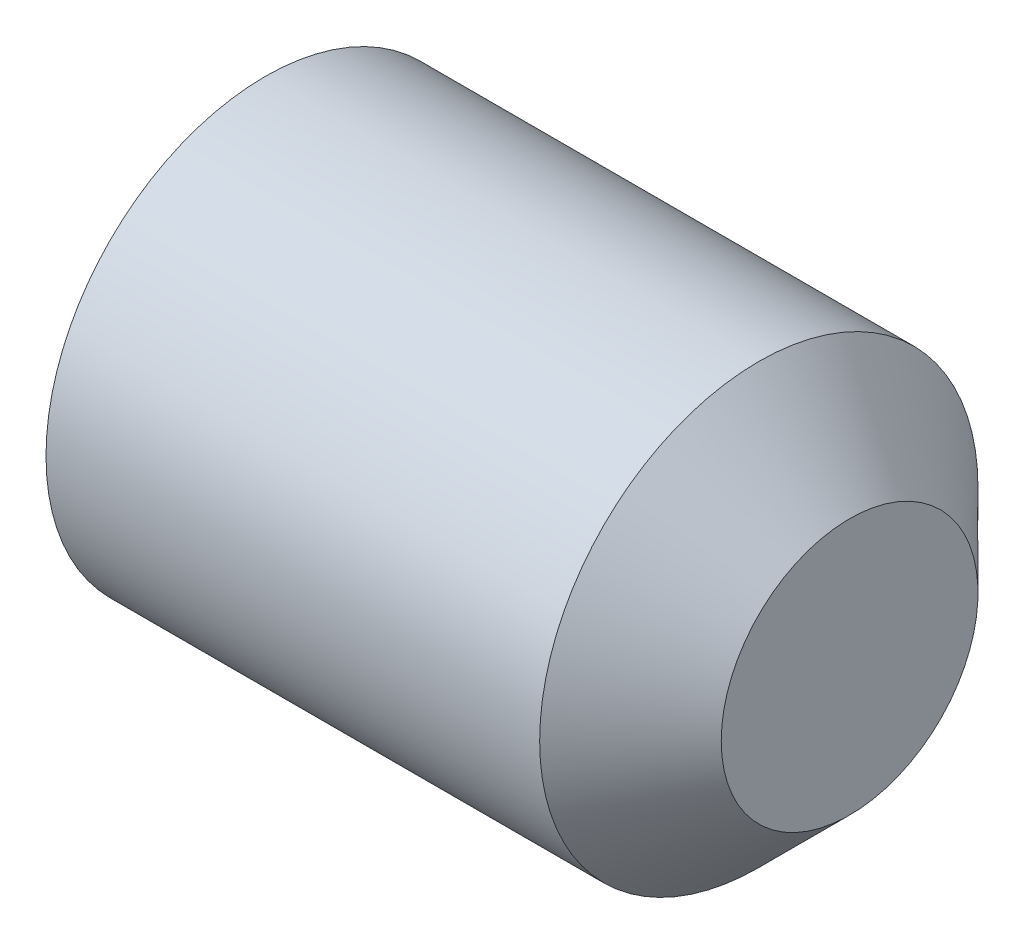
ISO-10303-21;
HEADER;
FILE_DESCRIPTION(('STEP AP214'),'2;1');
FILE_NAME('part.step','',(''),(''),'','','');
FILE_SCHEMA(('AUTOMOTIVE_DESIGN { 1 0 10303 214 1 1 1 1 }'));
ENDSEC;
DATA;
#1=APPLICATION_CONTEXT('core data for automotive mechanical design processes');
#2=APPLICATION_PROTOCOL_DEFINITION('international standard','automotive_design',2000,#1);
#3=PRODUCT_CONTEXT('',#1,'mechanical');
#4=PRODUCT('Part','Part','',(#3));
#5=PRODUCT_RELATED_PRODUCT_CATEGORY('part','',(#4));
#6=PRODUCT_DEFINITION_FORMATION('','',#4);
#7=PRODUCT_DEFINITION_CONTEXT('part definition',#1,'design');
#8=PRODUCT_DEFINITION('design','',#6,#7);
#9=PRODUCT_DEFINITION_SHAPE('','',#8);
#10=(LENGTH_UNIT() NAMED_UNIT(*) SI_UNIT(.MILLI.,.METRE.));
#11=(NAMED_UNIT(*) PLANE_ANGLE_UNIT() SI_UNIT($,.RADIAN.));
#12=(NAMED_UNIT(*) SI_UNIT($,.STERADIAN.) SOLID_ANGLE_UNIT());
#13=UNCERTAINTY_MEASURE_WITH_UNIT(LENGTH_MEASURE(1.E-05),#10,'distance_accuracy_value','');
#14=(GEOMETRIC_REPRESENTATION_CONTEXT(3) GLOBAL_UNCERTAINTY_ASSIGNED_CONTEXT((#13)) GLOBAL_UNIT_ASSIGNED_CONTEXT((#10,
#11,#12)) REPRESENTATION_CONTEXT('',''));
#15=CARTESIAN_POINT('',(0.,0.,0.));
#16=DIRECTION('',(0.,0.,1.));
#17=DIRECTION('',(1.,0.,0.));
#18=AXIS2_PLACEMENT_3D('',#15,#16,#17);
#19=CARTESIAN_POINT('',(0.,1.5,0.));
#20=DIRECTION('',(1.,0.,0.));
#21=DIRECTION('',(0.,0.,-1.));
#22=AXIS2_PLACEMENT_3D('',#19,#20,#21);
#23=PLANE('',#22);
#24=DIRECTION('',(0.,-0.866025403784439,-0.5));
#25=VECTOR('',#24,1.);
#26=CARTESIAN_POINT('',(0.,0.75,-0.433012701892219));
#27=LINE('',#26,#25);
#28=CARTESIAN_POINT('',(0.,0.75,-0.433012701892219));
#29=VERTEX_POINT('',#28);
#30=CARTESIAN_POINT('',(0.,0.,-0.866025403784438));
#31=VERTEX_POINT('',#30);
#32=EDGE_CURVE('E121',#29,#31,#27,.T.);
#33=ORIENTED_EDGE('',*,*,#32,.F.);
#34=DIRECTION('',(0.,0.,-1.));
#35=VECTOR('',#34,1.);
#36=CARTESIAN_POINT('',(0.,0.75,0.43301270189222));
#37=LINE('',#36,#35);
#38=CARTESIAN_POINT('',(0.,0.75,0.43301270189222));
#39=VERTEX_POINT('',#38);
#40=EDGE_CURVE('E47',#39,#29,#37,.T.);
#41=ORIENTED_EDGE('',*,*,#40,.F.);
#42=DIRECTION('',(0.,0.866025403784439,-0.5));
#43=VECTOR('',#42,1.);
#44=CARTESIAN_POINT('',(0.,0.,0.866025403784439));
#45=LINE('',#44,#43);
#46=CARTESIAN_POINT('',(0.,0.,0.866025403784439));
#47=VERTEX_POINT('',#46);
#48=EDGE_CURVE('E130',#47,#39,#45,.T.);
#49=ORIENTED_EDGE('',*,*,#48,.F.);
#50=DIRECTION('',(0.,0.866025403784439,0.5));
#51=VECTOR('',#50,1.);
#52=CARTESIAN_POINT('',(0.,-0.75,0.433012701892219));
#53=LINE('',#52,#51);
#54=CARTESIAN_POINT('',(0.,-0.75,0.433012701892219));
#55=VERTEX_POINT('',#54);
#56=EDGE_CURVE('E128',#55,#47,#53,.T.);
#57=ORIENTED_EDGE('',*,*,#56,.F.);
#58=DIRECTION('',(0.,0.,1.));
#59=VECTOR('',#58,1.);
#60=CARTESIAN_POINT('',(0.,-0.75,-0.43301270189222));
#61=LINE('',#60,#59);
#62=CARTESIAN_POINT('',(0.,-0.75,-0.43301270189222));
#63=VERTEX_POINT('',#62);
#64=EDGE_CURVE('E95',#63,#55,#61,.T.);
#65=ORIENTED_EDGE('',*,*,#64,.F.);
#66=DIRECTION('',(0.,-0.866025403784439,0.5));
#67=VECTOR('',#66,1.);
#68=CARTESIAN_POINT('',(0.,0.,-0.866025403784438));
#69=LINE('',#68,#67);
#70=EDGE_CURVE('E124',#31,#63,#69,.T.);
#71=ORIENTED_EDGE('',*,*,#70,.F.);
#72=EDGE_LOOP('',(#33,#41,#49,#57,#65,#71));
#73=FACE_BOUND('',#72,.T.);
#74=CARTESIAN_POINT('',(0.,0.,0.));
#75=DIRECTION('',(-1.,0.,0.));
#76=DIRECTION('',(0.,0.,1.));
#77=AXIS2_PLACEMENT_3D('',#74,#75,#76);
#78=CIRCLE('',#77,1.5);
#79=CARTESIAN_POINT('',(0.,0.,1.5));
#80=VERTEX_POINT('',#79);
#81=EDGE_CURVE('E11',#80,#80,#78,.T.);
#82=ORIENTED_EDGE('',*,*,#81,.T.);
#83=EDGE_LOOP('',(#82));
#84=FACE_BOUND('',#83,.T.);
#85=ADVANCED_FACE('F33',(#73,#84),#23,.F.);
#86=CARTESIAN_POINT('',(0.,0.,0.));
#87=DIRECTION('',(-1.,0.,0.));
#88=DIRECTION('',(0.,0.,1.));
#89=AXIS2_PLACEMENT_3D('',#86,#87,#88);
#90=CYLINDRICAL_SURFACE('',#89,1.5);
#91=ORIENTED_EDGE('',*,*,#81,.F.);
#92=EDGE_LOOP('',(#91));
#93=FACE_BOUND('',#92,.T.);
#94=CARTESIAN_POINT('',(3.37867965644036,0.,0.));
#95=DIRECTION('',(-1.,0.,0.));
#96=DIRECTION('',(0.,0.,1.));
#97=AXIS2_PLACEMENT_3D('',#94,#95,#96);
#98=CIRCLE('',#97,1.5);
#99=CARTESIAN_POINT('',(3.37867965644036,0.,1.5));
#100=VERTEX_POINT('',#99);
#101=EDGE_CURVE('E40',#100,#100,#98,.T.);
#102=ORIENTED_EDGE('',*,*,#101,.T.);
#103=EDGE_LOOP('',(#102));
#104=FACE_BOUND('',#103,.T.);
#105=ADVANCED_FACE('F144',(#93,#104),#90,.T.);
#106=CARTESIAN_POINT('',(4.,0.,0.));
#107=DIRECTION('',(-1.,0.,0.));
#108=DIRECTION('',(0.,0.,1.));
#109=AXIS2_PLACEMENT_3D('',#106,#107,#108);
#110=CONICAL_SURFACE('',#109,0.878679656440357,0.78539816339745);
#111=ORIENTED_EDGE('',*,*,#101,.F.);
#112=EDGE_LOOP('',(#111));
#113=FACE_BOUND('',#112,.T.);
#114=CARTESIAN_POINT('',(4.,0.,0.));
#115=DIRECTION('',(-1.,0.,0.));
#116=DIRECTION('',(0.,0.,1.));
#117=AXIS2_PLACEMENT_3D('',#114,#115,#116);
#118=CIRCLE('',#117,0.878679656440357);
#119=CARTESIAN_POINT('',(4.,0.,0.878679656440357));
#120=VERTEX_POINT('',#119);
#121=EDGE_CURVE('E134',#120,#120,#118,.T.);
#122=ORIENTED_EDGE('',*,*,#121,.T.);
#123=EDGE_LOOP('',(#122));
#124=FACE_BOUND('',#123,.T.);
#125=ADVANCED_FACE('F146',(#113,#124),#110,.T.);
#126=CARTESIAN_POINT('',(4.,0.878679656440357,0.));
#127=DIRECTION('',(-1.,0.,0.));
#128=DIRECTION('',(0.,0.,1.));
#129=AXIS2_PLACEMENT_3D('',#126,#127,#128);
#130=PLANE('',#129);
#131=ORIENTED_EDGE('',*,*,#121,.F.);
#132=EDGE_LOOP('',(#131));
#133=FACE_BOUND('',#132,.T.);
#134=ADVANCED_FACE('F149',(#133),#130,.F.);
#135=CARTESIAN_POINT('',(1.5,0.75,0.43301270189222));
#136=DIRECTION('',(0.,1.,0.));
#137=DIRECTION('',(0.,0.,1.));
#138=AXIS2_PLACEMENT_3D('',#135,#136,#137);
#139=PLANE('',#138);
#140=ORIENTED_EDGE('',*,*,#40,.T.);
#141=DIRECTION('',(-1.,0.,0.));
#142=VECTOR('',#141,1.);
#143=CARTESIAN_POINT('',(1.5,0.75,-0.433012701892219));
#144=LINE('',#143,#142);
#145=CARTESIAN_POINT('',(1.5,0.75,-0.433012701892219));
#146=VERTEX_POINT('',#145);
#147=EDGE_CURVE('E77',#146,#29,#144,.T.);
#148=ORIENTED_EDGE('',*,*,#147,.F.);
#149=DIRECTION('',(0.,0.,-1.));
#150=VECTOR('',#149,1.);
#151=CARTESIAN_POINT('',(1.5,0.75,0.43301270189222));
#152=LINE('',#151,#150);
#153=CARTESIAN_POINT('',(1.5,0.75,0.43301270189222));
#154=VERTEX_POINT('',#153);
#155=EDGE_CURVE('E132',#154,#146,#152,.T.);
#156=ORIENTED_EDGE('',*,*,#155,.F.);
#157=DIRECTION('',(-1.,0.,0.));
#158=VECTOR('',#157,1.);
#159=CARTESIAN_POINT('',(1.5,0.75,0.43301270189222));
#160=LINE('',#159,#158);
#161=EDGE_CURVE('E55',#154,#39,#160,.T.);
#162=ORIENTED_EDGE('',*,*,#161,.T.);
#163=EDGE_LOOP('',(#140,#148,#156,#162));
#164=FACE_BOUND('',#163,.T.);
#165=ADVANCED_FACE('F154',(#164),#139,.F.);
#166=CARTESIAN_POINT('',(1.5,0.,0.866025403784439));
#167=DIRECTION('',(0.,0.5,0.866025403784439));
#168=DIRECTION('',(0.,-0.866025403784439,0.5));
#169=AXIS2_PLACEMENT_3D('',#166,#167,#168);
#170=PLANE('',#169);
#171=ORIENTED_EDGE('',*,*,#48,.T.);
#172=ORIENTED_EDGE('',*,*,#161,.F.);
#173=DIRECTION('',(0.,0.866025403784439,-0.5));
#174=VECTOR('',#173,1.);
#175=CARTESIAN_POINT('',(1.5,0.,0.866025403784439));
#176=LINE('',#175,#174);
#177=CARTESIAN_POINT('',(1.5,0.,0.866025403784439));
#178=VERTEX_POINT('',#177);
#179=EDGE_CURVE('E107',#178,#154,#176,.T.);
#180=ORIENTED_EDGE('',*,*,#179,.F.);
#181=DIRECTION('',(-1.,0.,0.));
#182=VECTOR('',#181,1.);
#183=CARTESIAN_POINT('',(1.5,0.,0.866025403784439));
#184=LINE('',#183,#182);
#185=EDGE_CURVE('E99',#178,#47,#184,.T.);
#186=ORIENTED_EDGE('',*,*,#185,.T.);
#187=EDGE_LOOP('',(#171,#172,#180,#186));
#188=FACE_BOUND('',#187,.T.);
#189=ADVANCED_FACE('F159',(#188),#170,.F.);
#190=CARTESIAN_POINT('',(1.5,-0.75,0.433012701892219));
#191=DIRECTION('',(0.,-0.5,0.866025403784439));
#192=DIRECTION('',(0.,-0.866025403784439,-0.5));
#193=AXIS2_PLACEMENT_3D('',#190,#191,#192);
#194=PLANE('',#193);
#195=ORIENTED_EDGE('',*,*,#56,.T.);
#196=ORIENTED_EDGE('',*,*,#185,.F.);
#197=DIRECTION('',(0.,0.866025403784439,0.5));
#198=VECTOR('',#197,1.);
#199=CARTESIAN_POINT('',(1.5,-0.75,0.433012701892219));
#200=LINE('',#199,#198);
#201=CARTESIAN_POINT('',(1.5,-0.75,0.433012701892219));
#202=VERTEX_POINT('',#201);
#203=EDGE_CURVE('E103',#202,#178,#200,.T.);
#204=ORIENTED_EDGE('',*,*,#203,.F.);
#205=DIRECTION('',(-1.,0.,0.));
#206=VECTOR('',#205,1.);
#207=CARTESIAN_POINT('',(1.5,-0.75,0.433012701892219));
#208=LINE('',#207,#206);
#209=EDGE_CURVE('E88',#202,#55,#208,.T.);
#210=ORIENTED_EDGE('',*,*,#209,.T.);
#211=EDGE_LOOP('',(#195,#196,#204,#210));
#212=FACE_BOUND('',#211,.T.);
#213=ADVANCED_FACE('F104',(#212),#194,.F.);
#214=CARTESIAN_POINT('',(1.5,-0.75,-0.43301270189222));
#215=DIRECTION('',(0.,-1.,0.));
#216=DIRECTION('',(0.,0.,-1.));
#217=AXIS2_PLACEMENT_3D('',#214,#215,#216);
#218=PLANE('',#217);
#219=ORIENTED_EDGE('',*,*,#64,.T.);
#220=ORIENTED_EDGE('',*,*,#209,.F.);
#221=DIRECTION('',(0.,0.,1.));
#222=VECTOR('',#221,1.);
#223=CARTESIAN_POINT('',(1.5,-0.75,-0.43301270189222));
#224=LINE('',#223,#222);
#225=CARTESIAN_POINT('',(1.5,-0.75,-0.43301270189222));
#226=VERTEX_POINT('',#225);
#227=EDGE_CURVE('E92',#226,#202,#224,.T.);
#228=ORIENTED_EDGE('',*,*,#227,.F.);
#229=DIRECTION('',(-1.,0.,0.));
#230=VECTOR('',#229,1.);
#231=CARTESIAN_POINT('',(1.5,-0.75,-0.43301270189222));
#232=LINE('',#231,#230);
#233=EDGE_CURVE('E100',#226,#63,#232,.T.);
#234=ORIENTED_EDGE('',*,*,#233,.T.);
#235=EDGE_LOOP('',(#219,#220,#228,#234));
#236=FACE_BOUND('',#235,.T.);
#237=ADVANCED_FACE('F90',(#236),#218,.F.);
#238=CARTESIAN_POINT('',(1.5,0.,-0.866025403784438));
#239=DIRECTION('',(0.,-0.5,-0.866025403784439));
#240=DIRECTION('',(0.,0.866025403784439,-0.5));
#241=AXIS2_PLACEMENT_3D('',#238,#239,#240);
#242=PLANE('',#241);
#243=ORIENTED_EDGE('',*,*,#70,.T.);
#244=ORIENTED_EDGE('',*,*,#233,.F.);
#245=DIRECTION('',(0.,-0.866025403784439,0.5));
#246=VECTOR('',#245,1.);
#247=CARTESIAN_POINT('',(1.5,0.,-0.866025403784438));
#248=LINE('',#247,#246);
#249=CARTESIAN_POINT('',(1.5,0.,-0.866025403784438));
#250=VERTEX_POINT('',#249);
#251=EDGE_CURVE('E113',#250,#226,#248,.T.);
#252=ORIENTED_EDGE('',*,*,#251,.F.);
#253=DIRECTION('',(-1.,0.,0.));
#254=VECTOR('',#253,1.);
#255=CARTESIAN_POINT('',(1.5,0.,-0.866025403784438));
#256=LINE('',#255,#254);
#257=EDGE_CURVE('E137',#250,#31,#256,.T.);
#258=ORIENTED_EDGE('',*,*,#257,.T.);
#259=EDGE_LOOP('',(#243,#244,#252,#258));
#260=FACE_BOUND('',#259,.T.);
#261=ADVANCED_FACE('F185',(#260),#242,.F.);
#262=CARTESIAN_POINT('',(1.5,0.75,-0.433012701892219));
#263=DIRECTION('',(0.,0.5,-0.866025403784438));
#264=DIRECTION('',(0.,0.866025403784439,0.5));
#265=AXIS2_PLACEMENT_3D('',#262,#263,#264);
#266=PLANE('',#265);
#267=ORIENTED_EDGE('',*,*,#32,.T.);
#268=ORIENTED_EDGE('',*,*,#257,.F.);
#269=DIRECTION('',(0.,-0.866025403784439,-0.5));
#270=VECTOR('',#269,1.);
#271=CARTESIAN_POINT('',(1.5,0.75,-0.433012701892219));
#272=LINE('',#271,#270);
#273=EDGE_CURVE('E115',#146,#250,#272,.T.);
#274=ORIENTED_EDGE('',*,*,#273,.F.);
#275=ORIENTED_EDGE('',*,*,#147,.T.);
#276=EDGE_LOOP('',(#267,#268,#274,#275));
#277=FACE_BOUND('',#276,.T.);
#278=ADVANCED_FACE('F173',(#277),#266,.F.);
#279=CARTESIAN_POINT('',(1.5,0.75,-1.29903810567666));
#280=DIRECTION('',(-1.,0.,0.));
#281=DIRECTION('',(0.,0.,1.));
#282=AXIS2_PLACEMENT_3D('',#279,#280,#281);
#283=PLANE('',#282);
#284=ORIENTED_EDGE('',*,*,#155,.T.);
#285=ORIENTED_EDGE('',*,*,#273,.T.);
#286=ORIENTED_EDGE('',*,*,#251,.T.);
#287=ORIENTED_EDGE('',*,*,#227,.T.);
#288=ORIENTED_EDGE('',*,*,#203,.T.);
#289=ORIENTED_EDGE('',*,*,#179,.T.);
#290=EDGE_LOOP('',(#284,#285,#286,#287,#288,#289));
#291=FACE_BOUND('',#290,.T.);
#292=ADVANCED_FACE('F110',(#291),#283,.T.);
#293=CLOSED_SHELL('',(#85,#105,#125,#134,#165,#189,#213,#237,#261,#278,#292));
#294=MANIFOLD_SOLID_BREP('B2',#293);
#295=ADVANCED_BREP_SHAPE_REPRESENTATION('',(#18,#294),#14);
#296=SHAPE_DEFINITION_REPRESENTATION(#9,#295);
ENDSEC;
END-ISO-10303-21;
